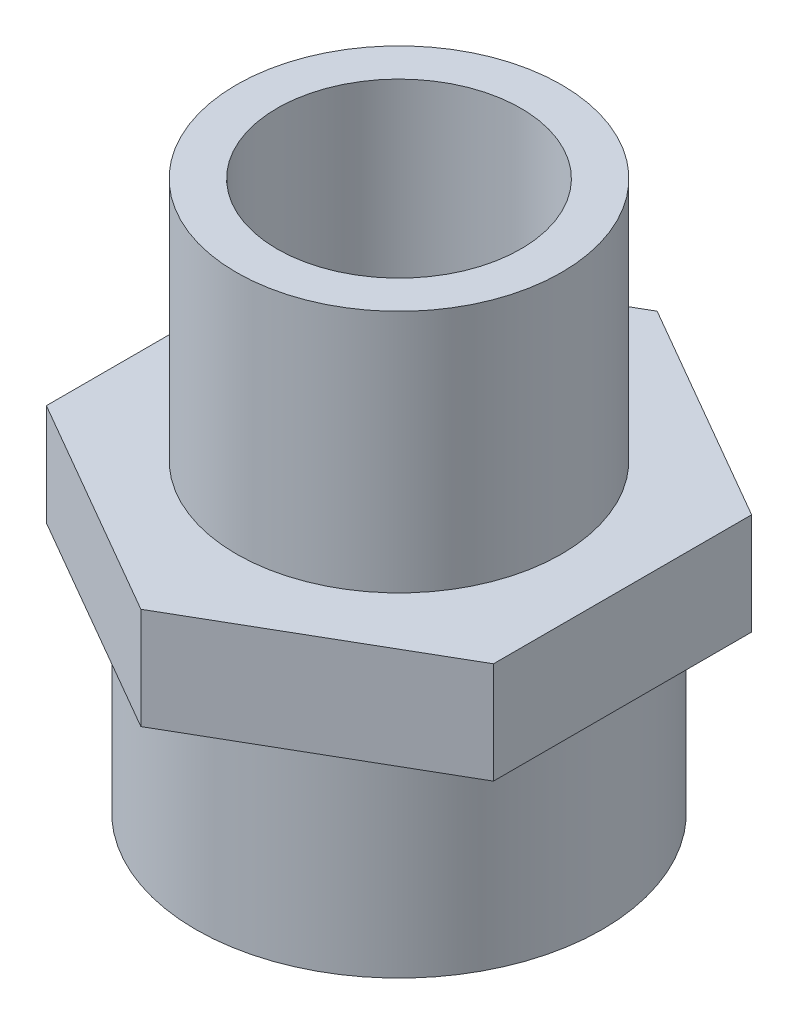
ISO-10303-21;
HEADER;
FILE_DESCRIPTION(('STEP AP214'),'2;1');
FILE_NAME('part.step','',(''),(''),'','','');
FILE_SCHEMA(('AUTOMOTIVE_DESIGN { 1 0 10303 214 1 1 1 1 }'));
ENDSEC;
DATA;
#1=APPLICATION_CONTEXT('core data for automotive mechanical design processes');
#2=APPLICATION_PROTOCOL_DEFINITION('international standard','automotive_design',2000,#1);
#3=PRODUCT_CONTEXT('',#1,'mechanical');
#4=PRODUCT('Part','Part','',(#3));
#5=PRODUCT_RELATED_PRODUCT_CATEGORY('part','',(#4));
#6=PRODUCT_DEFINITION_FORMATION('','',#4);
#7=PRODUCT_DEFINITION_CONTEXT('part definition',#1,'design');
#8=PRODUCT_DEFINITION('design','',#6,#7);
#9=PRODUCT_DEFINITION_SHAPE('','',#8);
#10=(LENGTH_UNIT() NAMED_UNIT(*) SI_UNIT(.MILLI.,.METRE.));
#11=(NAMED_UNIT(*) PLANE_ANGLE_UNIT() SI_UNIT($,.RADIAN.));
#12=(NAMED_UNIT(*) SI_UNIT($,.STERADIAN.) SOLID_ANGLE_UNIT());
#13=UNCERTAINTY_MEASURE_WITH_UNIT(LENGTH_MEASURE(1.E-05),#10,'distance_accuracy_value','');
#14=(GEOMETRIC_REPRESENTATION_CONTEXT(3) GLOBAL_UNCERTAINTY_ASSIGNED_CONTEXT((#13)) GLOBAL_UNIT_ASSIGNED_CONTEXT((#10,
#11,#12)) REPRESENTATION_CONTEXT('',''));
#15=CARTESIAN_POINT('',(0.,0.,0.));
#16=DIRECTION('',(0.,0.,1.));
#17=DIRECTION('',(1.,0.,0.));
#18=AXIS2_PLACEMENT_3D('',#15,#16,#17);
#19=CARTESIAN_POINT('',(0.,15.24,0.));
#20=DIRECTION('',(0.,-1.,0.));
#21=DIRECTION('',(0.,0.,-1.));
#22=AXIS2_PLACEMENT_3D('',#19,#20,#21);
#23=CYLINDRICAL_SURFACE('',#22,10.16);
#24=CARTESIAN_POINT('',(0.,15.24,0.));
#25=DIRECTION('',(0.,1.,0.));
#26=DIRECTION('',(0.,0.,1.));
#27=AXIS2_PLACEMENT_3D('',#24,#25,#26);
#28=CIRCLE('',#27,10.16);
#29=CARTESIAN_POINT('',(0.,15.24,-10.16));
#30=VERTEX_POINT('',#29);
#31=EDGE_CURVE('E49',#30,#30,#28,.T.);
#32=CARTESIAN_POINT('',(0.,0.,0.));
#33=DIRECTION('',(0.,1.,0.));
#34=DIRECTION('',(0.,0.,1.));
#35=AXIS2_PLACEMENT_3D('',#32,#33,#34);
#36=CIRCLE('',#35,10.16);
#37=CARTESIAN_POINT('',(0.,0.,-10.16));
#38=VERTEX_POINT('',#37);
#39=EDGE_CURVE('E42',#38,#38,#36,.T.);
#40=CARTESIAN_POINT('',(0.,15.24,-10.16));
#41=CARTESIAN_POINT('',(0.,15.08125,-10.16));
#42=CARTESIAN_POINT('',(0.,14.9225,-10.16));
#43=CARTESIAN_POINT('',(0.,14.605,-10.16));
#44=CARTESIAN_POINT('',(0.,14.44625,-10.16));
#45=CARTESIAN_POINT('',(0.,14.12875,-10.16));
#46=CARTESIAN_POINT('',(0.,13.97,-10.16));
#47=CARTESIAN_POINT('',(0.,13.6525,-10.16));
#48=CARTESIAN_POINT('',(0.,13.49375,-10.16));
#49=CARTESIAN_POINT('',(0.,13.17625,-10.16));
#50=CARTESIAN_POINT('',(0.,13.0175,-10.16));
#51=CARTESIAN_POINT('',(0.,12.7,-10.16));
#52=CARTESIAN_POINT('',(0.,12.54125,-10.16));
#53=CARTESIAN_POINT('',(0.,12.22375,-10.16));
#54=CARTESIAN_POINT('',(0.,12.065,-10.16));
#55=CARTESIAN_POINT('',(0.,11.7475,-10.16));
#56=CARTESIAN_POINT('',(0.,11.58875,-10.16));
#57=CARTESIAN_POINT('',(0.,11.27125,-10.16));
#58=CARTESIAN_POINT('',(0.,11.1125,-10.16));
#59=CARTESIAN_POINT('',(0.,10.795,-10.16));
#60=CARTESIAN_POINT('',(0.,10.63625,-10.16));
#61=CARTESIAN_POINT('',(0.,10.31875,-10.16));
#62=CARTESIAN_POINT('',(0.,10.16,-10.16));
#63=CARTESIAN_POINT('',(0.,9.8425,-10.16));
#64=CARTESIAN_POINT('',(0.,9.68375,-10.16));
#65=CARTESIAN_POINT('',(0.,9.36625,-10.16));
#66=CARTESIAN_POINT('',(0.,9.2075,-10.16));
#67=CARTESIAN_POINT('',(0.,8.89,-10.16));
#68=CARTESIAN_POINT('',(0.,8.73125,-10.16));
#69=CARTESIAN_POINT('',(0.,8.41375,-10.16));
#70=CARTESIAN_POINT('',(0.,8.255,-10.16));
#71=CARTESIAN_POINT('',(0.,7.9375,-10.16));
#72=CARTESIAN_POINT('',(0.,7.77875,-10.16));
#73=CARTESIAN_POINT('',(0.,7.46125,-10.16));
#74=CARTESIAN_POINT('',(0.,7.3025,-10.16));
#75=CARTESIAN_POINT('',(0.,6.985,-10.16));
#76=CARTESIAN_POINT('',(0.,6.82625,-10.16));
#77=CARTESIAN_POINT('',(0.,6.50875,-10.16));
#78=CARTESIAN_POINT('',(0.,6.35,-10.16));
#79=CARTESIAN_POINT('',(0.,6.0325,-10.16));
#80=CARTESIAN_POINT('',(0.,5.87375,-10.16));
#81=CARTESIAN_POINT('',(0.,5.55625,-10.16));
#82=CARTESIAN_POINT('',(0.,5.3975,-10.16));
#83=CARTESIAN_POINT('',(0.,5.08,-10.16));
#84=CARTESIAN_POINT('',(0.,4.92125,-10.16));
#85=CARTESIAN_POINT('',(0.,4.60375,-10.16));
#86=CARTESIAN_POINT('',(0.,4.445,-10.16));
#87=CARTESIAN_POINT('',(0.,4.1275,-10.16));
#88=CARTESIAN_POINT('',(0.,3.96875,-10.16));
#89=CARTESIAN_POINT('',(0.,3.65125,-10.16));
#90=CARTESIAN_POINT('',(0.,3.4925,-10.16));
#91=CARTESIAN_POINT('',(0.,3.175,-10.16));
#92=CARTESIAN_POINT('',(0.,3.01625,-10.16));
#93=CARTESIAN_POINT('',(0.,2.69875,-10.16));
#94=CARTESIAN_POINT('',(0.,2.54,-10.16));
#95=CARTESIAN_POINT('',(0.,2.2225,-10.16));
#96=CARTESIAN_POINT('',(0.,2.06375,-10.16));
#97=CARTESIAN_POINT('',(0.,1.74625,-10.16));
#98=CARTESIAN_POINT('',(0.,1.5875,-10.16));
#99=CARTESIAN_POINT('',(0.,1.27,-10.16));
#100=CARTESIAN_POINT('',(0.,1.11125,-10.16));
#101=CARTESIAN_POINT('',(0.,0.79375,-10.16));
#102=CARTESIAN_POINT('',(0.,0.634999999999999,-10.16));
#103=CARTESIAN_POINT('',(0.,0.3175,-10.16));
#104=CARTESIAN_POINT('',(0.,0.15875,-10.16));
#105=CARTESIAN_POINT('',(0.,0.,-10.16));
#106=B_SPLINE_CURVE_WITH_KNOTS('',3,(#40,#41,#42,#43,#44,#45,#46,#47,#48,#49,#50,#51,#52,#53,
#54,#55,#56,#57,#58,#59,#60,#61,#62,#63,#64,#65,#66,#67,#68,#69,#70,#71,#72,#73,#74,#75,#76,#77,
#78,#79,#80,#81,#82,#83,#84,#85,#86,#87,#88,#89,#90,#91,#92,#93,#94,#95,#96,#97,#98,#99,#100,
#101,#102,#103,#104,#105),.UNSPECIFIED.,.F.,.F.,(4,2,2,2,2,2,2,2,2,2,2,2,2,2,2,2,2,2,2,2,2,2,2,
2,2,2,2,2,2,2,2,2,4),(0.,0.476250000000001,0.9525,1.42875,1.905,2.38125,2.8575,3.33375,3.81,
4.28625,4.7625,5.23875,5.715,6.19125,6.6675,7.14375,7.62,8.09625,8.5725,9.04875,9.525,10.00125,
10.4775,10.95375,11.43,11.90625,12.3825,12.85875,13.335,13.81125,14.2875,14.76375,15.24),.UNSPECIFIED.);
#107=EDGE_CURVE('BSEAM39',#30,#38,#106,.T.);
#108=ORIENTED_EDGE('',*,*,#31,.F.);
#109=ORIENTED_EDGE('',*,*,#39,.T.);
#110=ORIENTED_EDGE('',*,*,#107,.T.);
#111=ORIENTED_EDGE('',*,*,#107,.F.);
#112=EDGE_LOOP('',(#108,#110,#109,#111));
#113=FACE_BOUND('',#112,.T.);
#114=ADVANCED_FACE('F39',(#113),#23,.T.);
#115=CARTESIAN_POINT('',(0.,15.24,0.));
#116=DIRECTION('',(0.,1.,0.));
#117=DIRECTION('',(0.,0.,1.));
#118=AXIS2_PLACEMENT_3D('',#115,#116,#117);
#119=PLANE('',#118);
#120=CARTESIAN_POINT('',(0.,15.24,0.));
#121=DIRECTION('',(0.,1.,0.));
#122=DIRECTION('',(0.,0.,1.));
#123=AXIS2_PLACEMENT_3D('',#120,#121,#122);
#124=CIRCLE('',#123,7.62);
#125=CARTESIAN_POINT('',(0.,15.24,7.62));
#126=VERTEX_POINT('',#125);
#127=EDGE_CURVE('E280',#126,#126,#124,.T.);
#128=ORIENTED_EDGE('',*,*,#127,.F.);
#129=EDGE_LOOP('',(#128));
#130=FACE_BOUND('',#129,.T.);
#131=ORIENTED_EDGE('',*,*,#31,.T.);
#132=EDGE_LOOP('',(#131));
#133=FACE_BOUND('',#132,.T.);
#134=ADVANCED_FACE('F192',(#130,#133),#119,.T.);
#135=CARTESIAN_POINT('',(-13.97,-6.35,8.06558326057906));
#136=DIRECTION('',(1.,0.,0.));
#137=DIRECTION('',(0.,0.,-1.));
#138=AXIS2_PLACEMENT_3D('',#135,#136,#137);
#139=PLANE('',#138);
#140=DIRECTION('',(0.,0.,-1.));
#141=VECTOR('',#140,1.);
#142=CARTESIAN_POINT('',(-13.97,0.,8.06558326057906));
#143=LINE('',#142,#141);
#144=CARTESIAN_POINT('',(-13.97,0.,8.06558326057906));
#145=VERTEX_POINT('',#144);
#146=CARTESIAN_POINT('',(-13.97,0.,-8.06558326057908));
#147=VERTEX_POINT('',#146);
#148=EDGE_CURVE('E131',#145,#147,#143,.T.);
#149=ORIENTED_EDGE('',*,*,#148,.T.);
#150=DIRECTION('',(0.,1.,0.));
#151=VECTOR('',#150,1.);
#152=CARTESIAN_POINT('',(-13.97,-6.35,-8.06558326057908));
#153=LINE('',#152,#151);
#154=CARTESIAN_POINT('',(-13.97,-6.35,-8.06558326057908));
#155=VERTEX_POINT('',#154);
#156=EDGE_CURVE('E159',#155,#147,#153,.T.);
#157=ORIENTED_EDGE('',*,*,#156,.F.);
#158=DIRECTION('',(0.,0.,-1.));
#159=VECTOR('',#158,1.);
#160=CARTESIAN_POINT('',(-13.97,-6.35,8.06558326057906));
#161=LINE('',#160,#159);
#162=CARTESIAN_POINT('',(-13.97,-6.35,8.06558326057906));
#163=VERTEX_POINT('',#162);
#164=EDGE_CURVE('E148',#163,#155,#161,.T.);
#165=ORIENTED_EDGE('',*,*,#164,.F.);
#166=DIRECTION('',(0.,1.,0.));
#167=VECTOR('',#166,1.);
#168=CARTESIAN_POINT('',(-13.97,-6.35,8.06558326057906));
#169=LINE('',#168,#167);
#170=EDGE_CURVE('E127',#163,#145,#169,.T.);
#171=ORIENTED_EDGE('',*,*,#170,.T.);
#172=EDGE_LOOP('',(#149,#157,#165,#171));
#173=FACE_BOUND('',#172,.T.);
#174=ADVANCED_FACE('F179',(#173),#139,.F.);
#175=CARTESIAN_POINT('',(-13.97,-6.35,-8.06558326057908));
#176=DIRECTION('',(0.5,0.,0.866025403784439));
#177=DIRECTION('',(0.866025403784439,0.,-0.5));
#178=AXIS2_PLACEMENT_3D('',#175,#176,#177);
#179=PLANE('',#178);
#180=DIRECTION('',(0.866025403784439,0.,-0.5));
#181=VECTOR('',#180,1.);
#182=CARTESIAN_POINT('',(-13.97,0.,-8.06558326057908));
#183=LINE('',#182,#181);
#184=CARTESIAN_POINT('',(0.,0.,-16.1311665211582));
#185=VERTEX_POINT('',#184);
#186=EDGE_CURVE('E135',#147,#185,#183,.T.);
#187=ORIENTED_EDGE('',*,*,#186,.T.);
#188=DIRECTION('',(0.,1.,0.));
#189=VECTOR('',#188,1.);
#190=CARTESIAN_POINT('',(0.,-6.35,-16.1311665211582));
#191=LINE('',#190,#189);
#192=CARTESIAN_POINT('',(0.,-6.35,-16.1311665211582));
#193=VERTEX_POINT('',#192);
#194=EDGE_CURVE('E155',#193,#185,#191,.T.);
#195=ORIENTED_EDGE('',*,*,#194,.F.);
#196=DIRECTION('',(0.866025403784439,0.,-0.5));
#197=VECTOR('',#196,1.);
#198=CARTESIAN_POINT('',(-13.97,-6.35,-8.06558326057908));
#199=LINE('',#198,#197);
#200=EDGE_CURVE('E96',#155,#193,#199,.T.);
#201=ORIENTED_EDGE('',*,*,#200,.F.);
#202=ORIENTED_EDGE('',*,*,#156,.T.);
#203=EDGE_LOOP('',(#187,#195,#201,#202));
#204=FACE_BOUND('',#203,.T.);
#205=ADVANCED_FACE('F201',(#204),#179,.F.);
#206=CARTESIAN_POINT('',(0.,-6.35,-16.1311665211582));
#207=DIRECTION('',(-0.5,0.,0.866025403784438));
#208=DIRECTION('',(0.866025403784438,0.,0.5));
#209=AXIS2_PLACEMENT_3D('',#206,#207,#208);
#210=PLANE('',#209);
#211=DIRECTION('',(0.866025403784438,0.,0.5));
#212=VECTOR('',#211,1.);
#213=CARTESIAN_POINT('',(0.,0.,-16.1311665211582));
#214=LINE('',#213,#212);
#215=CARTESIAN_POINT('',(13.97,0.,-8.06558326057907));
#216=VERTEX_POINT('',#215);
#217=EDGE_CURVE('E139',#185,#216,#214,.T.);
#218=ORIENTED_EDGE('',*,*,#217,.T.);
#219=DIRECTION('',(0.,1.,0.));
#220=VECTOR('',#219,1.);
#221=CARTESIAN_POINT('',(13.97,-6.35,-8.06558326057907));
#222=LINE('',#221,#220);
#223=CARTESIAN_POINT('',(13.97,-6.35,-8.06558326057907));
#224=VERTEX_POINT('',#223);
#225=EDGE_CURVE('E120',#224,#216,#222,.T.);
#226=ORIENTED_EDGE('',*,*,#225,.F.);
#227=DIRECTION('',(0.866025403784438,0.,0.5));
#228=VECTOR('',#227,1.);
#229=CARTESIAN_POINT('',(0.,-6.35,-16.1311665211582));
#230=LINE('',#229,#228);
#231=EDGE_CURVE('E109',#193,#224,#230,.T.);
#232=ORIENTED_EDGE('',*,*,#231,.F.);
#233=ORIENTED_EDGE('',*,*,#194,.T.);
#234=EDGE_LOOP('',(#218,#226,#232,#233));
#235=FACE_BOUND('',#234,.T.);
#236=ADVANCED_FACE('F207',(#235),#210,.F.);
#237=CARTESIAN_POINT('',(13.97,-6.35,-8.06558326057907));
#238=DIRECTION('',(-1.,0.,0.));
#239=DIRECTION('',(0.,0.,1.));
#240=AXIS2_PLACEMENT_3D('',#237,#238,#239);
#241=PLANE('',#240);
#242=DIRECTION('',(0.,0.,1.));
#243=VECTOR('',#242,1.);
#244=CARTESIAN_POINT('',(13.97,0.,-8.06558326057907));
#245=LINE('',#244,#243);
#246=CARTESIAN_POINT('',(13.97,0.,8.06558326057907));
#247=VERTEX_POINT('',#246);
#248=EDGE_CURVE('E118',#216,#247,#245,.T.);
#249=ORIENTED_EDGE('',*,*,#248,.T.);
#250=DIRECTION('',(0.,1.,0.));
#251=VECTOR('',#250,1.);
#252=CARTESIAN_POINT('',(13.97,-6.35,8.06558326057907));
#253=LINE('',#252,#251);
#254=CARTESIAN_POINT('',(13.97,-6.35,8.06558326057907));
#255=VERTEX_POINT('',#254);
#256=EDGE_CURVE('E115',#255,#247,#253,.T.);
#257=ORIENTED_EDGE('',*,*,#256,.F.);
#258=DIRECTION('',(0.,0.,1.));
#259=VECTOR('',#258,1.);
#260=CARTESIAN_POINT('',(13.97,-6.35,-8.06558326057907));
#261=LINE('',#260,#259);
#262=EDGE_CURVE('E103',#224,#255,#261,.T.);
#263=ORIENTED_EDGE('',*,*,#262,.F.);
#264=ORIENTED_EDGE('',*,*,#225,.T.);
#265=EDGE_LOOP('',(#249,#257,#263,#264));
#266=FACE_BOUND('',#265,.T.);
#267=ADVANCED_FACE('F116',(#266),#241,.F.);
#268=CARTESIAN_POINT('',(13.97,-6.35,8.06558326057907));
#269=DIRECTION('',(-0.5,0.,-0.866025403784438));
#270=DIRECTION('',(-0.866025403784439,0.,0.5));
#271=AXIS2_PLACEMENT_3D('',#268,#269,#270);
#272=PLANE('',#271);
#273=DIRECTION('',(-0.866025403784438,0.,0.5));
#274=VECTOR('',#273,1.);
#275=CARTESIAN_POINT('',(13.97,0.,8.06558326057907));
#276=LINE('',#275,#274);
#277=CARTESIAN_POINT('',(0.,0.,16.1311665211581));
#278=VERTEX_POINT('',#277);
#279=EDGE_CURVE('E81',#247,#278,#276,.T.);
#280=ORIENTED_EDGE('',*,*,#279,.T.);
#281=DIRECTION('',(0.,1.,0.));
#282=VECTOR('',#281,1.);
#283=CARTESIAN_POINT('',(0.,-6.35,16.1311665211581));
#284=LINE('',#283,#282);
#285=CARTESIAN_POINT('',(0.,-6.35,16.1311665211581));
#286=VERTEX_POINT('',#285);
#287=EDGE_CURVE('E121',#286,#278,#284,.T.);
#288=ORIENTED_EDGE('',*,*,#287,.F.);
#289=DIRECTION('',(-0.866025403784438,0.,0.5));
#290=VECTOR('',#289,1.);
#291=CARTESIAN_POINT('',(13.97,-6.35,8.06558326057907));
#292=LINE('',#291,#290);
#293=EDGE_CURVE('E107',#255,#286,#292,.T.);
#294=ORIENTED_EDGE('',*,*,#293,.F.);
#295=ORIENTED_EDGE('',*,*,#256,.T.);
#296=EDGE_LOOP('',(#280,#288,#294,#295));
#297=FACE_BOUND('',#296,.T.);
#298=ADVANCED_FACE('F123',(#297),#272,.F.);
#299=CARTESIAN_POINT('',(0.,-6.35,16.1311665211581));
#300=DIRECTION('',(0.5,0.,-0.866025403784439));
#301=DIRECTION('',(-0.866025403784439,0.,-0.5));
#302=AXIS2_PLACEMENT_3D('',#299,#300,#301);
#303=PLANE('',#302);
#304=DIRECTION('',(-0.866025403784438,0.,-0.5));
#305=VECTOR('',#304,1.);
#306=CARTESIAN_POINT('',(0.,0.,16.1311665211581));
#307=LINE('',#306,#305);
#308=EDGE_CURVE('E87',#278,#145,#307,.T.);
#309=ORIENTED_EDGE('',*,*,#308,.T.);
#310=ORIENTED_EDGE('',*,*,#170,.F.);
#311=DIRECTION('',(-0.866025403784438,0.,-0.5));
#312=VECTOR('',#311,1.);
#313=CARTESIAN_POINT('',(0.,-6.35,16.1311665211581));
#314=LINE('',#313,#312);
#315=EDGE_CURVE('E58',#286,#163,#314,.T.);
#316=ORIENTED_EDGE('',*,*,#315,.F.);
#317=ORIENTED_EDGE('',*,*,#287,.T.);
#318=EDGE_LOOP('',(#309,#310,#316,#317));
#319=FACE_BOUND('',#318,.T.);
#320=ADVANCED_FACE('F181',(#319),#303,.F.);
#321=CARTESIAN_POINT('',(0.,-6.35,0.));
#322=DIRECTION('',(0.,-1.,0.));
#323=DIRECTION('',(0.,0.,-1.));
#324=AXIS2_PLACEMENT_3D('',#321,#322,#323);
#325=PLANE('',#324);
#326=CARTESIAN_POINT('',(0.,-6.35,0.));
#327=DIRECTION('',(0.,-1.,0.));
#328=DIRECTION('',(0.,0.,-1.));
#329=AXIS2_PLACEMENT_3D('',#326,#327,#328);
#330=CIRCLE('',#329,12.7);
#331=CARTESIAN_POINT('',(0.,-6.35,-12.7));
#332=VERTEX_POINT('',#331);
#333=EDGE_CURVE('E11',#332,#332,#330,.T.);
#334=ORIENTED_EDGE('',*,*,#333,.F.);
#335=EDGE_LOOP('',(#334));
#336=FACE_BOUND('',#335,.T.);
#337=ORIENTED_EDGE('',*,*,#164,.T.);
#338=ORIENTED_EDGE('',*,*,#200,.T.);
#339=ORIENTED_EDGE('',*,*,#231,.T.);
#340=ORIENTED_EDGE('',*,*,#262,.T.);
#341=ORIENTED_EDGE('',*,*,#293,.T.);
#342=ORIENTED_EDGE('',*,*,#315,.T.);
#343=EDGE_LOOP('',(#337,#338,#339,#340,#341,#342));
#344=FACE_BOUND('',#343,.T.);
#345=ADVANCED_FACE('F105',(#336,#344),#325,.T.);
#346=CARTESIAN_POINT('',(0.,0.,0.));
#347=DIRECTION('',(0.,-1.,0.));
#348=DIRECTION('',(0.,0.,-1.));
#349=AXIS2_PLACEMENT_3D('',#346,#347,#348);
#350=PLANE('',#349);
#351=ORIENTED_EDGE('',*,*,#39,.F.);
#352=EDGE_LOOP('',(#351));
#353=FACE_BOUND('',#352,.T.);
#354=ORIENTED_EDGE('',*,*,#148,.F.);
#355=ORIENTED_EDGE('',*,*,#308,.F.);
#356=ORIENTED_EDGE('',*,*,#279,.F.);
#357=ORIENTED_EDGE('',*,*,#248,.F.);
#358=ORIENTED_EDGE('',*,*,#217,.F.);
#359=ORIENTED_EDGE('',*,*,#186,.F.);
#360=EDGE_LOOP('',(#354,#355,#356,#357,#358,#359));
#361=FACE_BOUND('',#360,.T.);
#362=ADVANCED_FACE('F170',(#353,#361),#350,.F.);
#363=CARTESIAN_POINT('',(0.,-19.05,0.));
#364=DIRECTION('',(0.,1.,0.));
#365=DIRECTION('',(0.,0.,1.));
#366=AXIS2_PLACEMENT_3D('',#363,#364,#365);
#367=CYLINDRICAL_SURFACE('',#366,12.7);
#368=CARTESIAN_POINT('',(0.,-19.05,0.));
#369=DIRECTION('',(0.,-1.,0.));
#370=DIRECTION('',(0.,0.,-1.));
#371=AXIS2_PLACEMENT_3D('',#368,#369,#370);
#372=CIRCLE('',#371,12.7);
#373=CARTESIAN_POINT('',(0.,-19.05,-12.7));
#374=VERTEX_POINT('',#373);
#375=EDGE_CURVE('E136',#374,#374,#372,.T.);
#376=ORIENTED_EDGE('',*,*,#375,.F.);
#377=EDGE_LOOP('',(#376));
#378=FACE_BOUND('',#377,.T.);
#379=ORIENTED_EDGE('',*,*,#333,.T.);
#380=EDGE_LOOP('',(#379));
#381=FACE_BOUND('',#380,.T.);
#382=ADVANCED_FACE('F173',(#378,#381),#367,.T.);
#383=CARTESIAN_POINT('',(0.,-19.05,0.));
#384=DIRECTION('',(0.,-1.,0.));
#385=DIRECTION('',(0.,0.,-1.));
#386=AXIS2_PLACEMENT_3D('',#383,#384,#385);
#387=PLANE('',#386);
#388=CARTESIAN_POINT('',(0.,-19.05,0.));
#389=DIRECTION('',(0.,1.,0.));
#390=DIRECTION('',(0.,0.,1.));
#391=AXIS2_PLACEMENT_3D('',#388,#389,#390);
#392=CIRCLE('',#391,7.62);
#393=CARTESIAN_POINT('',(0.,-19.05,7.62));
#394=VERTEX_POINT('',#393);
#395=EDGE_CURVE('E278',#394,#394,#392,.T.);
#396=ORIENTED_EDGE('',*,*,#395,.T.);
#397=EDGE_LOOP('',(#396));
#398=FACE_BOUND('',#397,.T.);
#399=ORIENTED_EDGE('',*,*,#375,.T.);
#400=EDGE_LOOP('',(#399));
#401=FACE_BOUND('',#400,.T.);
#402=ADVANCED_FACE('F244',(#398,#401),#387,.T.);
#403=CARTESIAN_POINT('',(0.,-19.05,0.));
#404=DIRECTION('',(0.,1.,0.));
#405=DIRECTION('',(0.,0.,1.));
#406=AXIS2_PLACEMENT_3D('',#403,#404,#405);
#407=CYLINDRICAL_SURFACE('',#406,7.62);
#408=ORIENTED_EDGE('',*,*,#395,.F.);
#409=EDGE_LOOP('',(#408));
#410=FACE_BOUND('',#409,.T.);
#411=ORIENTED_EDGE('',*,*,#127,.T.);
#412=EDGE_LOOP('',(#411));
#413=FACE_BOUND('',#412,.T.);
#414=ADVANCED_FACE('F261',(#410,#413),#407,.F.);
#415=CLOSED_SHELL('',(#114,#134,#174,#205,#236,#267,#298,#320,#345,#362,#382,#402,#414));
#416=MANIFOLD_SOLID_BREP('B2',#415);
#417=ADVANCED_BREP_SHAPE_REPRESENTATION('',(#18,#416),#14);
#418=SHAPE_DEFINITION_REPRESENTATION(#9,#417);
ENDSEC;
END-ISO-10303-21;
